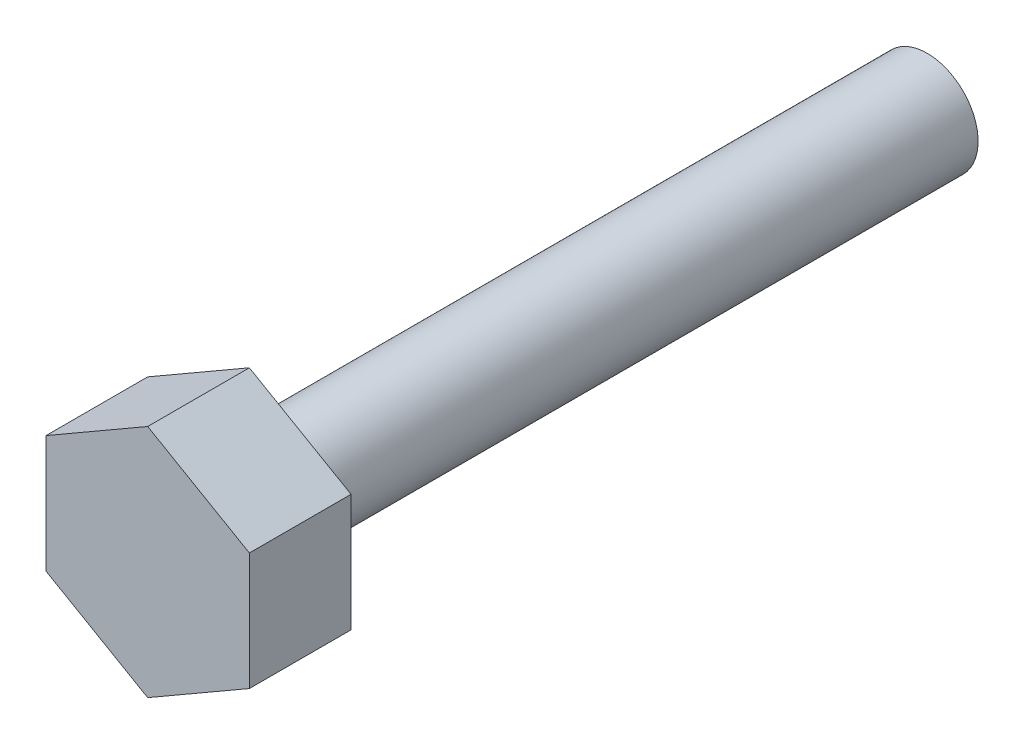
ISO-10303-21;
HEADER;
FILE_DESCRIPTION(('STEP AP214'),'2;1');
FILE_NAME('part.step','',(''),(''),'','','');
FILE_SCHEMA(('AUTOMOTIVE_DESIGN { 1 0 10303 214 1 1 1 1 }'));
ENDSEC;
DATA;
#1=APPLICATION_CONTEXT('core data for automotive mechanical design processes');
#2=APPLICATION_PROTOCOL_DEFINITION('international standard','automotive_design',2000,#1);
#3=PRODUCT_CONTEXT('',#1,'mechanical');
#4=PRODUCT('Part','Part','',(#3));
#5=PRODUCT_RELATED_PRODUCT_CATEGORY('part','',(#4));
#6=PRODUCT_DEFINITION_FORMATION('','',#4);
#7=PRODUCT_DEFINITION_CONTEXT('part definition',#1,'design');
#8=PRODUCT_DEFINITION('design','',#6,#7);
#9=PRODUCT_DEFINITION_SHAPE('','',#8);
#10=(LENGTH_UNIT() NAMED_UNIT(*) SI_UNIT(.MILLI.,.METRE.));
#11=(NAMED_UNIT(*) PLANE_ANGLE_UNIT() SI_UNIT($,.RADIAN.));
#12=(NAMED_UNIT(*) SI_UNIT($,.STERADIAN.) SOLID_ANGLE_UNIT());
#13=UNCERTAINTY_MEASURE_WITH_UNIT(LENGTH_MEASURE(1.E-05),#10,'distance_accuracy_value','');
#14=(GEOMETRIC_REPRESENTATION_CONTEXT(3) GLOBAL_UNCERTAINTY_ASSIGNED_CONTEXT((#13)) GLOBAL_UNIT_ASSIGNED_CONTEXT((#10,
#11,#12)) REPRESENTATION_CONTEXT('',''));
#15=CARTESIAN_POINT('',(0.,0.,0.));
#16=DIRECTION('',(0.,0.,1.));
#17=DIRECTION('',(1.,0.,0.));
#18=AXIS2_PLACEMENT_3D('',#15,#16,#17);
#19=CARTESIAN_POINT('',(5.99999999999995,3.46410161513782,3.));
#20=DIRECTION('',(-0.499999999999995,-0.866025403784441,0.));
#21=DIRECTION('',(0.866025403784442,-0.499999999999995,0.));
#22=AXIS2_PLACEMENT_3D('',#19,#20,#21);
#23=PLANE('',#22);
#24=DIRECTION('',(-0.866025403784442,0.499999999999995,0.));
#25=VECTOR('',#24,1.);
#26=CARTESIAN_POINT('',(5.99999999999995,3.46410161513782,-3.));
#27=LINE('',#26,#25);
#28=CARTESIAN_POINT('',(5.99999999999995,3.46410161513782,-3.));
#29=VERTEX_POINT('',#28);
#30=CARTESIAN_POINT('',(0.,6.9282032302755,-3.));
#31=VERTEX_POINT('',#30);
#32=EDGE_CURVE('E122',#29,#31,#27,.T.);
#33=ORIENTED_EDGE('',*,*,#32,.T.);
#34=DIRECTION('',(0.,0.,-1.));
#35=VECTOR('',#34,1.);
#36=CARTESIAN_POINT('',(0.,6.9282032302755,3.));
#37=LINE('',#36,#35);
#38=CARTESIAN_POINT('',(0.,6.9282032302755,3.));
#39=VERTEX_POINT('',#38);
#40=EDGE_CURVE('E39',#39,#31,#37,.T.);
#41=ORIENTED_EDGE('',*,*,#40,.F.);
#42=DIRECTION('',(-0.866025403784442,0.499999999999995,0.));
#43=VECTOR('',#42,1.);
#44=CARTESIAN_POINT('',(5.99999999999995,3.46410161513782,3.));
#45=LINE('',#44,#43);
#46=CARTESIAN_POINT('',(5.99999999999995,3.46410161513782,3.));
#47=VERTEX_POINT('',#46);
#48=EDGE_CURVE('E133',#47,#39,#45,.T.);
#49=ORIENTED_EDGE('',*,*,#48,.F.);
#50=DIRECTION('',(0.,0.,-1.));
#51=VECTOR('',#50,1.);
#52=CARTESIAN_POINT('',(5.99999999999995,3.46410161513782,3.));
#53=LINE('',#52,#51);
#54=EDGE_CURVE('E118',#47,#29,#53,.T.);
#55=ORIENTED_EDGE('',*,*,#54,.T.);
#56=EDGE_LOOP('',(#33,#41,#49,#55));
#57=FACE_BOUND('',#56,.T.);
#58=ADVANCED_FACE('F36',(#57),#23,.F.);
#59=CARTESIAN_POINT('',(0.,6.9282032302755,3.));
#60=DIRECTION('',(0.500000000000001,-0.866025403784438,0.));
#61=DIRECTION('',(0.866025403784438,0.500000000000001,0.));
#62=AXIS2_PLACEMENT_3D('',#59,#60,#61);
#63=PLANE('',#62);
#64=DIRECTION('',(-0.866025403784438,-0.500000000000001,0.));
#65=VECTOR('',#64,1.);
#66=CARTESIAN_POINT('',(0.,6.9282032302755,-3.));
#67=LINE('',#66,#65);
#68=CARTESIAN_POINT('',(-6.,3.46410161513774,-3.));
#69=VERTEX_POINT('',#68);
#70=EDGE_CURVE('E125',#31,#69,#67,.T.);
#71=ORIENTED_EDGE('',*,*,#70,.T.);
#72=DIRECTION('',(0.,0.,-1.));
#73=VECTOR('',#72,1.);
#74=CARTESIAN_POINT('',(-6.,3.46410161513774,3.));
#75=LINE('',#74,#73);
#76=CARTESIAN_POINT('',(-6.,3.46410161513774,3.));
#77=VERTEX_POINT('',#76);
#78=EDGE_CURVE('E136',#77,#69,#75,.T.);
#79=ORIENTED_EDGE('',*,*,#78,.F.);
#80=DIRECTION('',(-0.866025403784438,-0.500000000000001,0.));
#81=VECTOR('',#80,1.);
#82=CARTESIAN_POINT('',(0.,6.9282032302755,3.));
#83=LINE('',#82,#81);
#84=EDGE_CURVE('E91',#39,#77,#83,.T.);
#85=ORIENTED_EDGE('',*,*,#84,.F.);
#86=ORIENTED_EDGE('',*,*,#40,.T.);
#87=EDGE_LOOP('',(#71,#79,#85,#86));
#88=FACE_BOUND('',#87,.T.);
#89=ADVANCED_FACE('F141',(#88),#63,.F.);
#90=CARTESIAN_POINT('',(-6.,3.46410161513774,3.));
#91=DIRECTION('',(1.,0.,0.));
#92=DIRECTION('',(0.,1.,0.));
#93=AXIS2_PLACEMENT_3D('',#90,#91,#92);
#94=PLANE('',#93);
#95=DIRECTION('',(0.,-1.,0.));
#96=VECTOR('',#95,1.);
#97=CARTESIAN_POINT('',(-6.,3.46410161513774,-3.));
#98=LINE('',#97,#96);
#99=CARTESIAN_POINT('',(-5.99999999999998,-3.46410161513778,-3.));
#100=VERTEX_POINT('',#99);
#101=EDGE_CURVE('E128',#69,#100,#98,.T.);
#102=ORIENTED_EDGE('',*,*,#101,.T.);
#103=DIRECTION('',(0.,0.,-1.));
#104=VECTOR('',#103,1.);
#105=CARTESIAN_POINT('',(-5.99999999999998,-3.46410161513778,3.));
#106=LINE('',#105,#104);
#107=CARTESIAN_POINT('',(-5.99999999999998,-3.46410161513778,3.));
#108=VERTEX_POINT('',#107);
#109=EDGE_CURVE('E113',#108,#100,#106,.T.);
#110=ORIENTED_EDGE('',*,*,#109,.F.);
#111=DIRECTION('',(0.,-1.,0.));
#112=VECTOR('',#111,1.);
#113=CARTESIAN_POINT('',(-6.,3.46410161513774,3.));
#114=LINE('',#113,#112);
#115=EDGE_CURVE('E104',#77,#108,#114,.T.);
#116=ORIENTED_EDGE('',*,*,#115,.F.);
#117=ORIENTED_EDGE('',*,*,#78,.T.);
#118=EDGE_LOOP('',(#102,#110,#116,#117));
#119=FACE_BOUND('',#118,.T.);
#120=ADVANCED_FACE('F147',(#119),#94,.F.);
#121=CARTESIAN_POINT('',(-5.99999999999998,-3.46410161513778,3.));
#122=DIRECTION('',(0.499999999999995,0.866025403784441,0.));
#123=DIRECTION('',(-0.866025403784442,0.499999999999995,0.));
#124=AXIS2_PLACEMENT_3D('',#121,#122,#123);
#125=PLANE('',#124);
#126=DIRECTION('',(0.866025403784442,-0.499999999999995,0.));
#127=VECTOR('',#126,1.);
#128=CARTESIAN_POINT('',(-5.99999999999998,-3.46410161513778,-3.));
#129=LINE('',#128,#127);
#130=CARTESIAN_POINT('',(0.,-6.9282032302755,-3.));
#131=VERTEX_POINT('',#130);
#132=EDGE_CURVE('E112',#100,#131,#129,.T.);
#133=ORIENTED_EDGE('',*,*,#132,.T.);
#134=DIRECTION('',(0.,0.,-1.));
#135=VECTOR('',#134,1.);
#136=CARTESIAN_POINT('',(0.,-6.9282032302755,3.));
#137=LINE('',#136,#135);
#138=CARTESIAN_POINT('',(0.,-6.9282032302755,3.));
#139=VERTEX_POINT('',#138);
#140=EDGE_CURVE('E109',#139,#131,#137,.T.);
#141=ORIENTED_EDGE('',*,*,#140,.F.);
#142=DIRECTION('',(0.866025403784442,-0.499999999999995,0.));
#143=VECTOR('',#142,1.);
#144=CARTESIAN_POINT('',(-5.99999999999998,-3.46410161513778,3.));
#145=LINE('',#144,#143);
#146=EDGE_CURVE('E98',#108,#139,#145,.T.);
#147=ORIENTED_EDGE('',*,*,#146,.F.);
#148=ORIENTED_EDGE('',*,*,#109,.T.);
#149=EDGE_LOOP('',(#133,#141,#147,#148));
#150=FACE_BOUND('',#149,.T.);
#151=ADVANCED_FACE('F110',(#150),#125,.F.);
#152=CARTESIAN_POINT('',(0.,-6.9282032302755,3.));
#153=DIRECTION('',(-0.500000000000007,0.866025403784435,0.));
#154=DIRECTION('',(-0.866025403784434,-0.500000000000007,0.));
#155=AXIS2_PLACEMENT_3D('',#152,#153,#154);
#156=PLANE('',#155);
#157=DIRECTION('',(0.866025403784435,0.500000000000007,0.));
#158=VECTOR('',#157,1.);
#159=CARTESIAN_POINT('',(0.,-6.9282032302755,-3.));
#160=LINE('',#159,#158);
#161=CARTESIAN_POINT('',(6.00000000000002,-3.46410161513769,-3.));
#162=VERTEX_POINT('',#161);
#163=EDGE_CURVE('E76',#131,#162,#160,.T.);
#164=ORIENTED_EDGE('',*,*,#163,.T.);
#165=DIRECTION('',(0.,0.,-1.));
#166=VECTOR('',#165,1.);
#167=CARTESIAN_POINT('',(6.00000000000002,-3.46410161513769,3.));
#168=LINE('',#167,#166);
#169=CARTESIAN_POINT('',(6.00000000000002,-3.46410161513769,3.));
#170=VERTEX_POINT('',#169);
#171=EDGE_CURVE('E114',#170,#162,#168,.T.);
#172=ORIENTED_EDGE('',*,*,#171,.F.);
#173=DIRECTION('',(0.866025403784435,0.500000000000007,0.));
#174=VECTOR('',#173,1.);
#175=CARTESIAN_POINT('',(0.,-6.9282032302755,3.));
#176=LINE('',#175,#174);
#177=EDGE_CURVE('E102',#139,#170,#176,.T.);
#178=ORIENTED_EDGE('',*,*,#177,.F.);
#179=ORIENTED_EDGE('',*,*,#140,.T.);
#180=EDGE_LOOP('',(#164,#172,#178,#179));
#181=FACE_BOUND('',#180,.T.);
#182=ADVANCED_FACE('F116',(#181),#156,.F.);
#183=CARTESIAN_POINT('',(6.00000000000002,-3.46410161513769,3.));
#184=DIRECTION('',(-1.,0.,0.));
#185=DIRECTION('',(0.,-1.,0.));
#186=AXIS2_PLACEMENT_3D('',#183,#184,#185);
#187=PLANE('',#186);
#188=DIRECTION('',(0.,1.,0.));
#189=VECTOR('',#188,1.);
#190=CARTESIAN_POINT('',(6.00000000000002,-3.46410161513769,-3.));
#191=LINE('',#190,#189);
#192=EDGE_CURVE('E82',#162,#29,#191,.T.);
#193=ORIENTED_EDGE('',*,*,#192,.T.);
#194=ORIENTED_EDGE('',*,*,#54,.F.);
#195=DIRECTION('',(0.,1.,0.));
#196=VECTOR('',#195,1.);
#197=CARTESIAN_POINT('',(6.00000000000002,-3.46410161513769,3.));
#198=LINE('',#197,#196);
#199=EDGE_CURVE('E53',#170,#47,#198,.T.);
#200=ORIENTED_EDGE('',*,*,#199,.F.);
#201=ORIENTED_EDGE('',*,*,#171,.T.);
#202=EDGE_LOOP('',(#193,#194,#200,#201));
#203=FACE_BOUND('',#202,.T.);
#204=ADVANCED_FACE('F167',(#203),#187,.F.);
#205=CARTESIAN_POINT('',(0.,0.,3.));
#206=DIRECTION('',(0.,0.,1.));
#207=DIRECTION('',(1.,0.,0.));
#208=AXIS2_PLACEMENT_3D('',#205,#206,#207);
#209=PLANE('',#208);
#210=ORIENTED_EDGE('',*,*,#48,.T.);
#211=ORIENTED_EDGE('',*,*,#84,.T.);
#212=ORIENTED_EDGE('',*,*,#115,.T.);
#213=ORIENTED_EDGE('',*,*,#146,.T.);
#214=ORIENTED_EDGE('',*,*,#177,.T.);
#215=ORIENTED_EDGE('',*,*,#199,.T.);
#216=EDGE_LOOP('',(#210,#211,#212,#213,#214,#215));
#217=FACE_BOUND('',#216,.T.);
#218=ADVANCED_FACE('F100',(#217),#209,.T.);
#219=CARTESIAN_POINT('',(0.,0.,-3.));
#220=DIRECTION('',(0.,0.,1.));
#221=DIRECTION('',(1.,0.,0.));
#222=AXIS2_PLACEMENT_3D('',#219,#220,#221);
#223=PLANE('',#222);
#224=CARTESIAN_POINT('',(0.,0.,-3.));
#225=DIRECTION('',(0.,0.,-1.));
#226=DIRECTION('',(-1.,0.,0.));
#227=AXIS2_PLACEMENT_3D('',#224,#225,#226);
#228=CIRCLE('',#227,3.);
#229=CARTESIAN_POINT('',(-3.,0.,-3.));
#230=VERTEX_POINT('',#229);
#231=EDGE_CURVE('E11',#230,#230,#228,.T.);
#232=ORIENTED_EDGE('',*,*,#231,.F.);
#233=EDGE_LOOP('',(#232));
#234=FACE_BOUND('',#233,.T.);
#235=ORIENTED_EDGE('',*,*,#32,.F.);
#236=ORIENTED_EDGE('',*,*,#192,.F.);
#237=ORIENTED_EDGE('',*,*,#163,.F.);
#238=ORIENTED_EDGE('',*,*,#132,.F.);
#239=ORIENTED_EDGE('',*,*,#101,.F.);
#240=ORIENTED_EDGE('',*,*,#70,.F.);
#241=EDGE_LOOP('',(#235,#236,#237,#238,#239,#240));
#242=FACE_BOUND('',#241,.T.);
#243=ADVANCED_FACE('F146',(#234,#242),#223,.F.);
#244=CARTESIAN_POINT('',(0.,0.,-43.));
#245=DIRECTION('',(0.,0.,1.));
#246=DIRECTION('',(1.,0.,0.));
#247=AXIS2_PLACEMENT_3D('',#244,#245,#246);
#248=CYLINDRICAL_SURFACE('',#247,3.);
#249=CARTESIAN_POINT('',(0.,0.,-43.));
#250=DIRECTION('',(0.,0.,-1.));
#251=DIRECTION('',(-1.,0.,0.));
#252=AXIS2_PLACEMENT_3D('',#249,#250,#251);
#253=CIRCLE('',#252,3.);
#254=CARTESIAN_POINT('',(-3.,0.,-43.));
#255=VERTEX_POINT('',#254);
#256=EDGE_CURVE('E126',#255,#255,#253,.T.);
#257=ORIENTED_EDGE('',*,*,#256,.F.);
#258=EDGE_LOOP('',(#257));
#259=FACE_BOUND('',#258,.T.);
#260=ORIENTED_EDGE('',*,*,#231,.T.);
#261=EDGE_LOOP('',(#260));
#262=FACE_BOUND('',#261,.T.);
#263=ADVANCED_FACE('F156',(#259,#262),#248,.T.);
#264=CARTESIAN_POINT('',(0.,0.,-43.));
#265=DIRECTION('',(0.,0.,-1.));
#266=DIRECTION('',(-1.,0.,0.));
#267=AXIS2_PLACEMENT_3D('',#264,#265,#266);
#268=PLANE('',#267);
#269=ORIENTED_EDGE('',*,*,#256,.T.);
#270=EDGE_LOOP('',(#269));
#271=FACE_BOUND('',#270,.T.);
#272=ADVANCED_FACE('F154',(#271),#268,.T.);
#273=CLOSED_SHELL('',(#58,#89,#120,#151,#182,#204,#218,#243,#263,#272));
#274=MANIFOLD_SOLID_BREP('B2',#273);
#275=ADVANCED_BREP_SHAPE_REPRESENTATION('',(#18,#274),#14);
#276=SHAPE_DEFINITION_REPRESENTATION(#9,#275);
ENDSEC;
END-ISO-10303-21;
